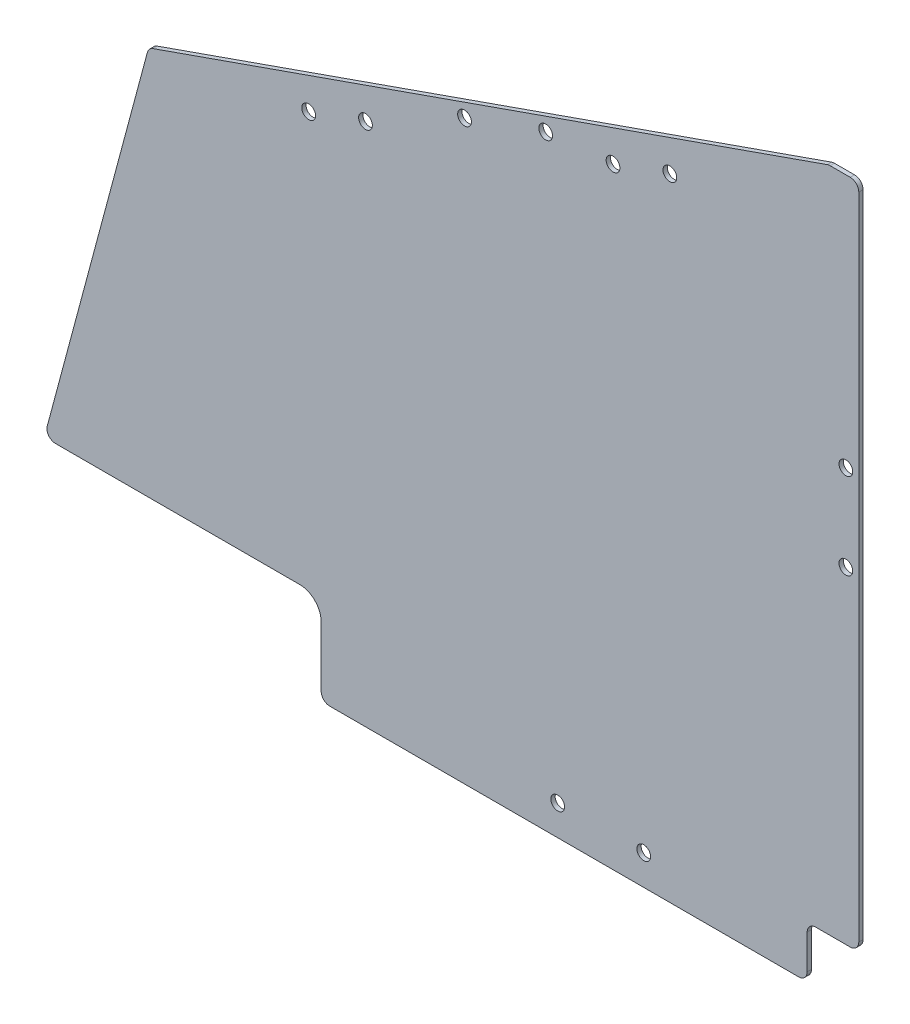
ISO-10303-21;
HEADER;
FILE_DESCRIPTION(('STEP AP214'),'2;1');
FILE_NAME('part.step','',(''),(''),'','','');
FILE_SCHEMA(('AUTOMOTIVE_DESIGN { 1 0 10303 214 1 1 1 1 }'));
ENDSEC;
DATA;
#1=APPLICATION_CONTEXT('core data for automotive mechanical design processes');
#2=APPLICATION_PROTOCOL_DEFINITION('international standard','automotive_design',2000,#1);
#3=PRODUCT_CONTEXT('',#1,'mechanical');
#4=PRODUCT('Part','Part','',(#3));
#5=PRODUCT_RELATED_PRODUCT_CATEGORY('part','',(#4));
#6=PRODUCT_DEFINITION_FORMATION('','',#4);
#7=PRODUCT_DEFINITION_CONTEXT('part definition',#1,'design');
#8=PRODUCT_DEFINITION('design','',#6,#7);
#9=PRODUCT_DEFINITION_SHAPE('','',#8);
#10=(LENGTH_UNIT() NAMED_UNIT(*) SI_UNIT(.MILLI.,.METRE.));
#11=(NAMED_UNIT(*) PLANE_ANGLE_UNIT() SI_UNIT($,.RADIAN.));
#12=(NAMED_UNIT(*) SI_UNIT($,.STERADIAN.) SOLID_ANGLE_UNIT());
#13=UNCERTAINTY_MEASURE_WITH_UNIT(LENGTH_MEASURE(1.E-05),#10,'distance_accuracy_value','');
#14=(GEOMETRIC_REPRESENTATION_CONTEXT(3) GLOBAL_UNCERTAINTY_ASSIGNED_CONTEXT((#13)) GLOBAL_UNIT_ASSIGNED_CONTEXT((#10,
#11,#12)) REPRESENTATION_CONTEXT('',''));
#15=CARTESIAN_POINT('',(0.,0.,0.));
#16=DIRECTION('',(0.,0.,1.));
#17=DIRECTION('',(1.,0.,0.));
#18=AXIS2_PLACEMENT_3D('',#15,#16,#17);
#19=CARTESIAN_POINT('',(95.,-83.5,1.));
#20=DIRECTION('',(-1.,0.,0.));
#21=DIRECTION('',(0.,0.,1.));
#22=AXIS2_PLACEMENT_3D('',#19,#20,#21);
#23=PLANE('',#22);
#24=DIRECTION('',(0.,1.,0.));
#25=VECTOR('',#24,1.);
#26=CARTESIAN_POINT('',(95.,-83.5,1.));
#27=LINE('',#26,#25);
#28=CARTESIAN_POINT('',(95.,-69.5,1.));
#29=VERTEX_POINT('',#28);
#30=CARTESIAN_POINT('',(95.,81.4999999999999,1.));
#31=VERTEX_POINT('',#30);
#32=EDGE_CURVE('E208',#29,#31,#27,.T.);
#33=ORIENTED_EDGE('',*,*,#32,.F.);
#34=DIRECTION('',(0.,0.,-1.));
#35=VECTOR('',#34,1.);
#36=CARTESIAN_POINT('',(95.,-69.5,1.));
#37=LINE('',#36,#35);
#38=CARTESIAN_POINT('',(95.,-69.5,0.));
#39=VERTEX_POINT('',#38);
#40=EDGE_CURVE('E296',#29,#39,#37,.T.);
#41=ORIENTED_EDGE('',*,*,#40,.T.);
#42=DIRECTION('',(0.,1.,0.));
#43=VECTOR('',#42,1.);
#44=CARTESIAN_POINT('',(95.,-83.5,0.));
#45=LINE('',#44,#43);
#46=CARTESIAN_POINT('',(95.,81.4999999999999,0.));
#47=VERTEX_POINT('',#46);
#48=EDGE_CURVE('E203',#39,#47,#45,.T.);
#49=ORIENTED_EDGE('',*,*,#48,.T.);
#50=DIRECTION('',(0.,0.,-1.));
#51=VECTOR('',#50,1.);
#52=CARTESIAN_POINT('',(95.,81.5,1.));
#53=LINE('',#52,#51);
#54=EDGE_CURVE('E239',#47,#31,#53,.F.);
#55=ORIENTED_EDGE('',*,*,#54,.T.);
#56=EDGE_LOOP('',(#33,#41,#49,#55));
#57=FACE_BOUND('',#56,.T.);
#58=ADVANCED_FACE('F36',(#57),#23,.F.);
#59=CARTESIAN_POINT('',(-95.,83.5,1.));
#60=DIRECTION('',(0.,-1.,0.));
#61=DIRECTION('',(0.,0.,-1.));
#62=AXIS2_PLACEMENT_3D('',#59,#60,#61);
#63=PLANE('',#62);
#64=DIRECTION('',(-1.,0.,0.));
#65=VECTOR('',#64,1.);
#66=CARTESIAN_POINT('',(-95.,83.5,1.));
#67=LINE('',#66,#65);
#68=CARTESIAN_POINT('',(93.,83.5,1.));
#69=VERTEX_POINT('',#68);
#70=CARTESIAN_POINT('',(88.3407996901378,83.5,1.));
#71=VERTEX_POINT('',#70);
#72=EDGE_CURVE('E210',#69,#71,#67,.T.);
#73=ORIENTED_EDGE('',*,*,#72,.F.);
#74=DIRECTION('',(0.,0.,-1.));
#75=VECTOR('',#74,1.);
#76=CARTESIAN_POINT('',(93.,83.5,1.));
#77=LINE('',#76,#75);
#78=CARTESIAN_POINT('',(93.,83.5,0.));
#79=VERTEX_POINT('',#78);
#80=EDGE_CURVE('E226',#69,#79,#77,.T.);
#81=ORIENTED_EDGE('',*,*,#80,.T.);
#82=DIRECTION('',(-1.,0.,0.));
#83=VECTOR('',#82,1.);
#84=CARTESIAN_POINT('',(-95.,83.5,0.));
#85=LINE('',#84,#83);
#86=CARTESIAN_POINT('',(88.3407996901378,83.5,0.));
#87=VERTEX_POINT('',#86);
#88=EDGE_CURVE('E217',#79,#87,#85,.T.);
#89=ORIENTED_EDGE('',*,*,#88,.T.);
#90=DIRECTION('',(0.,0.,-1.));
#91=VECTOR('',#90,1.);
#92=CARTESIAN_POINT('',(88.3407996901378,83.5,1.));
#93=LINE('',#92,#91);
#94=EDGE_CURVE('E224',#87,#71,#93,.F.);
#95=ORIENTED_EDGE('',*,*,#94,.T.);
#96=EDGE_LOOP('',(#73,#81,#89,#95));
#97=FACE_BOUND('',#96,.T.);
#98=ADVANCED_FACE('F392',(#97),#63,.F.);
#99=CARTESIAN_POINT('',(-95.,-83.5,1.));
#100=DIRECTION('',(0.,1.,0.));
#101=DIRECTION('',(0.,0.,1.));
#102=AXIS2_PLACEMENT_3D('',#99,#100,#101);
#103=PLANE('',#102);
#104=DIRECTION('',(1.,0.,0.));
#105=VECTOR('',#104,1.);
#106=CARTESIAN_POINT('',(-95.,-83.5,0.));
#107=LINE('',#106,#105);
#108=CARTESIAN_POINT('',(-28.,-83.5,0.));
#109=VERTEX_POINT('',#108);
#110=CARTESIAN_POINT('',(81.,-83.5,0.));
#111=VERTEX_POINT('',#110);
#112=EDGE_CURVE('E211',#109,#111,#107,.T.);
#113=ORIENTED_EDGE('',*,*,#112,.T.);
#114=DIRECTION('',(0.,0.,-1.));
#115=VECTOR('',#114,1.);
#116=CARTESIAN_POINT('',(81.,-83.5,1.));
#117=LINE('',#116,#115);
#118=CARTESIAN_POINT('',(81.,-83.5,1.));
#119=VERTEX_POINT('',#118);
#120=EDGE_CURVE('E287',#111,#119,#117,.F.);
#121=ORIENTED_EDGE('',*,*,#120,.T.);
#122=DIRECTION('',(1.,0.,0.));
#123=VECTOR('',#122,1.);
#124=CARTESIAN_POINT('',(-95.,-83.5,1.));
#125=LINE('',#124,#123);
#126=CARTESIAN_POINT('',(-28.,-83.5,1.));
#127=VERTEX_POINT('',#126);
#128=EDGE_CURVE('E185',#127,#119,#125,.T.);
#129=ORIENTED_EDGE('',*,*,#128,.F.);
#130=DIRECTION('',(0.,0.,-1.));
#131=VECTOR('',#130,1.);
#132=CARTESIAN_POINT('',(-28.,-83.5,1.));
#133=LINE('',#132,#131);
#134=EDGE_CURVE('E252',#127,#109,#133,.T.);
#135=ORIENTED_EDGE('',*,*,#134,.T.);
#136=EDGE_LOOP('',(#113,#121,#129,#135));
#137=FACE_BOUND('',#136,.T.);
#138=ADVANCED_FACE('F367',(#137),#103,.F.);
#139=CARTESIAN_POINT('',(0.,0.,1.));
#140=DIRECTION('',(0.,0.,-1.));
#141=DIRECTION('',(-1.,0.,0.));
#142=AXIS2_PLACEMENT_3D('',#139,#140,#141);
#143=PLANE('',#142);
#144=CARTESIAN_POINT('',(-32.9066829554804,33.7501487597334,1.));
#145=DIRECTION('',(0.,0.,1.));
#146=DIRECTION('',(1.,0.,0.));
#147=AXIS2_PLACEMENT_3D('',#144,#145,#146);
#148=CIRCLE('',#147,1.6);
#149=CARTESIAN_POINT('',(-31.3066829554804,33.7501487597334,1.));
#150=VERTEX_POINT('',#149);
#151=EDGE_CURVE('E304',#150,#150,#148,.T.);
#152=ORIENTED_EDGE('',*,*,#151,.F.);
#153=EDGE_LOOP('',(#152));
#154=FACE_BOUND('',#153,.T.);
#155=CARTESIAN_POINT('',(-19.6967533873127,38.386716542485,1.));
#156=DIRECTION('',(0.,0.,1.));
#157=DIRECTION('',(1.,0.,0.));
#158=AXIS2_PLACEMENT_3D('',#155,#156,#157);
#159=CIRCLE('',#158,1.6);
#160=CARTESIAN_POINT('',(-18.0967533873127,38.386716542485,1.));
#161=VERTEX_POINT('',#160);
#162=EDGE_CURVE('E626',#161,#161,#159,.T.);
#163=ORIENTED_EDGE('',*,*,#162,.F.);
#164=EDGE_LOOP('',(#163));
#165=FACE_BOUND('',#164,.T.);
#166=CARTESIAN_POINT('',(37.8607968739892,58.5889047387597,1.));
#167=DIRECTION('',(0.,0.,1.));
#168=DIRECTION('',(1.,0.,0.));
#169=AXIS2_PLACEMENT_3D('',#166,#167,#168);
#170=CIRCLE('',#169,1.6);
#171=CARTESIAN_POINT('',(39.4607968739892,58.5889047387597,1.));
#172=VERTEX_POINT('',#171);
#173=EDGE_CURVE('E629',#172,#172,#170,.T.);
#174=ORIENTED_EDGE('',*,*,#173,.F.);
#175=EDGE_LOOP('',(#174));
#176=FACE_BOUND('',#175,.T.);
#177=CARTESIAN_POINT('',(51.0707264421569,63.2254725215113,1.));
#178=DIRECTION('',(0.,0.,1.));
#179=DIRECTION('',(1.,0.,0.));
#180=AXIS2_PLACEMENT_3D('',#177,#178,#179);
#181=CIRCLE('',#180,1.6);
#182=CARTESIAN_POINT('',(52.6707264421569,63.2254725215113,1.));
#183=VERTEX_POINT('',#182);
#184=EDGE_CURVE('E322',#183,#183,#181,.T.);
#185=ORIENTED_EDGE('',*,*,#184,.F.);
#186=EDGE_LOOP('',(#185));
#187=FACE_BOUND('',#186,.T.);
#188=CARTESIAN_POINT('',(45.,-76.5,1.));
#189=DIRECTION('',(0.,0.,1.));
#190=DIRECTION('',(1.,0.,0.));
#191=AXIS2_PLACEMENT_3D('',#188,#189,#190);
#192=CIRCLE('',#191,1.6);
#193=CARTESIAN_POINT('',(46.6,-76.5,1.));
#194=VERTEX_POINT('',#193);
#195=EDGE_CURVE('E275',#194,#194,#192,.T.);
#196=ORIENTED_EDGE('',*,*,#195,.F.);
#197=EDGE_LOOP('',(#196));
#198=FACE_BOUND('',#197,.T.);
#199=CARTESIAN_POINT('',(25.,-76.5,1.));
#200=DIRECTION('',(0.,0.,1.));
#201=DIRECTION('',(1.,0.,0.));
#202=AXIS2_PLACEMENT_3D('',#199,#200,#201);
#203=CIRCLE('',#202,1.6);
#204=CARTESIAN_POINT('',(26.6,-76.5,1.));
#205=VERTEX_POINT('',#204);
#206=EDGE_CURVE('E329',#205,#205,#203,.T.);
#207=ORIENTED_EDGE('',*,*,#206,.F.);
#208=EDGE_LOOP('',(#207));
#209=FACE_BOUND('',#208,.T.);
#210=CARTESIAN_POINT('',(22.2057566978976,57.2273793176486,0.999999999999999));
#211=DIRECTION('',(0.,0.,-1.));
#212=DIRECTION('',(-1.,0.,0.));
#213=AXIS2_PLACEMENT_3D('',#210,#211,#212);
#214=CIRCLE('',#213,1.6);
#215=CARTESIAN_POINT('',(20.6057566978976,57.2273793176486,0.999999999999999));
#216=VERTEX_POINT('',#215);
#217=EDGE_CURVE('E342',#216,#216,#214,.T.);
#218=ORIENTED_EDGE('',*,*,#217,.T.);
#219=EDGE_LOOP('',(#218));
#220=FACE_BOUND('',#219,.T.);
#221=CARTESIAN_POINT('',(3.33442874337234,50.6037110565749,0.999999999999999));
#222=DIRECTION('',(0.,0.,-1.));
#223=DIRECTION('',(-1.,0.,0.));
#224=AXIS2_PLACEMENT_3D('',#221,#222,#223);
#225=CIRCLE('',#224,1.6);
#226=CARTESIAN_POINT('',(1.73442874337234,50.6037110565749,0.999999999999999));
#227=VERTEX_POINT('',#226);
#228=EDGE_CURVE('E337',#227,#227,#225,.T.);
#229=ORIENTED_EDGE('',*,*,#228,.T.);
#230=EDGE_LOOP('',(#229));
#231=FACE_BOUND('',#230,.T.);
#232=CARTESIAN_POINT('',(92.,4.50000000000004,1.));
#233=DIRECTION('',(0.,0.,-1.));
#234=DIRECTION('',(-1.,0.,0.));
#235=AXIS2_PLACEMENT_3D('',#232,#233,#234);
#236=CIRCLE('',#235,1.60000000000001);
#237=CARTESIAN_POINT('',(90.4,4.50000000000004,1.));
#238=VERTEX_POINT('',#237);
#239=EDGE_CURVE('E196',#238,#238,#236,.T.);
#240=ORIENTED_EDGE('',*,*,#239,.T.);
#241=EDGE_LOOP('',(#240));
#242=FACE_BOUND('',#241,.T.);
#243=CARTESIAN_POINT('',(92.,24.5,1.));
#244=DIRECTION('',(0.,0.,-1.));
#245=DIRECTION('',(-1.,0.,0.));
#246=AXIS2_PLACEMENT_3D('',#243,#244,#245);
#247=CIRCLE('',#246,1.6);
#248=CARTESIAN_POINT('',(90.4,24.5,1.));
#249=VERTEX_POINT('',#248);
#250=EDGE_CURVE('E351',#249,#249,#247,.T.);
#251=ORIENTED_EDGE('',*,*,#250,.T.);
#252=EDGE_LOOP('',(#251));
#253=FACE_BOUND('',#252,.T.);
#254=ORIENTED_EDGE('',*,*,#128,.T.);
#255=CARTESIAN_POINT('',(81.,-81.5,0.999999999999999));
#256=DIRECTION('',(0.,0.,-1.));
#257=DIRECTION('',(-1.,0.,0.));
#258=AXIS2_PLACEMENT_3D('',#255,#256,#257);
#259=CIRCLE('',#258,2.);
#260=CARTESIAN_POINT('',(83.,-81.5,1.));
#261=VERTEX_POINT('',#260);
#262=EDGE_CURVE('E290',#119,#261,#259,.F.);
#263=ORIENTED_EDGE('',*,*,#262,.T.);
#264=DIRECTION('',(0.,1.,0.));
#265=VECTOR('',#264,1.);
#266=CARTESIAN_POINT('',(83.,0.,1.));
#267=LINE('',#266,#265);
#268=CARTESIAN_POINT('',(83.,-73.5,1.));
#269=VERTEX_POINT('',#268);
#270=EDGE_CURVE('E319',#261,#269,#267,.T.);
#271=ORIENTED_EDGE('',*,*,#270,.T.);
#272=CARTESIAN_POINT('',(85.,-73.5,0.999999999999999));
#273=DIRECTION('',(0.,0.,-1.));
#274=DIRECTION('',(-1.,0.,0.));
#275=AXIS2_PLACEMENT_3D('',#272,#273,#274);
#276=CIRCLE('',#275,2.);
#277=CARTESIAN_POINT('',(85.,-71.5,1.));
#278=VERTEX_POINT('',#277);
#279=EDGE_CURVE('E11',#269,#278,#276,.T.);
#280=ORIENTED_EDGE('',*,*,#279,.T.);
#281=DIRECTION('',(1.,0.,0.));
#282=VECTOR('',#281,1.);
#283=CARTESIAN_POINT('',(0.,-71.5,1.));
#284=LINE('',#283,#282);
#285=CARTESIAN_POINT('',(93.,-71.5,1.));
#286=VERTEX_POINT('',#285);
#287=EDGE_CURVE('E327',#278,#286,#284,.T.);
#288=ORIENTED_EDGE('',*,*,#287,.T.);
#289=CARTESIAN_POINT('',(93.,-69.5,1.));
#290=DIRECTION('',(0.,0.,-1.));
#291=DIRECTION('',(-1.,0.,0.));
#292=AXIS2_PLACEMENT_3D('',#289,#290,#291);
#293=CIRCLE('',#292,2.);
#294=EDGE_CURVE('E53',#286,#29,#293,.F.);
#295=ORIENTED_EDGE('',*,*,#294,.T.);
#296=ORIENTED_EDGE('',*,*,#32,.T.);
#297=CARTESIAN_POINT('',(93.,81.5,1.));
#298=DIRECTION('',(0.,0.,-1.));
#299=DIRECTION('',(-1.,0.,0.));
#300=AXIS2_PLACEMENT_3D('',#297,#298,#299);
#301=CIRCLE('',#300,2.);
#302=EDGE_CURVE('E250',#31,#69,#301,.F.);
#303=ORIENTED_EDGE('',*,*,#302,.T.);
#304=ORIENTED_EDGE('',*,*,#72,.T.);
#305=CARTESIAN_POINT('',(88.3407996901378,81.5,1.));
#306=DIRECTION('',(0.,0.,-1.));
#307=DIRECTION('',(-1.,0.,0.));
#308=AXIS2_PLACEMENT_3D('',#305,#306,#307);
#309=CIRCLE('',#308,2.);
#310=CARTESIAN_POINT('',(87.6784328640304,83.3871327954525,1.));
#311=VERTEX_POINT('',#310);
#312=EDGE_CURVE('E246',#71,#311,#309,.F.);
#313=ORIENTED_EDGE('',*,*,#312,.T.);
#314=DIRECTION('',(-0.943566397726261,-0.331183413053685,0.));
#315=VECTOR('',#314,1.);
#316=CARTESIAN_POINT('',(88.,83.5,1.));
#317=LINE('',#316,#315);
#318=CARTESIAN_POINT('',(-69.1274427162054,28.3496651761363,1.));
#319=VERTEX_POINT('',#318);
#320=EDGE_CURVE('E207',#311,#319,#317,.T.);
#321=ORIENTED_EDGE('',*,*,#320,.T.);
#322=CARTESIAN_POINT('',(-68.465075890098,26.4625323806838,1.));
#323=DIRECTION('',(0.,0.,-1.));
#324=DIRECTION('',(-1.,0.,0.));
#325=AXIS2_PLACEMENT_3D('',#322,#323,#324);
#326=CIRCLE('',#325,2.);
#327=CARTESIAN_POINT('',(-70.3969275426762,26.9801704708888,1.));
#328=VERTEX_POINT('',#327);
#329=EDGE_CURVE('E248',#319,#328,#326,.F.);
#330=ORIENTED_EDGE('',*,*,#329,.T.);
#331=DIRECTION('',(-0.258819045102491,-0.965925826289076,0.));
#332=VECTOR('',#331,1.);
#333=CARTESIAN_POINT('',(-100.,-83.5,1.));
#334=LINE('',#333,#332);
#335=CARTESIAN_POINT('',(-93.6984678658429,-59.982361909795,1.));
#336=VERTEX_POINT('',#335);
#337=EDGE_CURVE('E200',#328,#336,#334,.T.);
#338=ORIENTED_EDGE('',*,*,#337,.T.);
#339=CARTESIAN_POINT('',(-91.7666162132648,-60.5,1.));
#340=DIRECTION('',(0.,0.,-1.));
#341=DIRECTION('',(-1.,0.,0.));
#342=AXIS2_PLACEMENT_3D('',#339,#340,#341);
#343=CIRCLE('',#342,2.);
#344=CARTESIAN_POINT('',(-91.7666162132648,-62.5,1.));
#345=VERTEX_POINT('',#344);
#346=EDGE_CURVE('E242',#336,#345,#343,.F.);
#347=ORIENTED_EDGE('',*,*,#346,.T.);
#348=DIRECTION('',(1.,0.,0.));
#349=VECTOR('',#348,1.);
#350=CARTESIAN_POINT('',(-30.,-62.5,1.));
#351=LINE('',#350,#349);
#352=CARTESIAN_POINT('',(-35.,-62.5,1.));
#353=VERTEX_POINT('',#352);
#354=EDGE_CURVE('E192',#345,#353,#351,.T.);
#355=ORIENTED_EDGE('',*,*,#354,.T.);
#356=CARTESIAN_POINT('',(-35.,-67.5,1.));
#357=DIRECTION('',(0.,0.,-1.));
#358=DIRECTION('',(-1.,0.,0.));
#359=AXIS2_PLACEMENT_3D('',#356,#357,#358);
#360=CIRCLE('',#359,5.);
#361=CARTESIAN_POINT('',(-30.,-67.5,1.));
#362=VERTEX_POINT('',#361);
#363=EDGE_CURVE('E175',#353,#362,#360,.T.);
#364=ORIENTED_EDGE('',*,*,#363,.T.);
#365=DIRECTION('',(0.,-1.,0.));
#366=VECTOR('',#365,1.);
#367=CARTESIAN_POINT('',(-30.,-83.5,1.));
#368=LINE('',#367,#366);
#369=CARTESIAN_POINT('',(-30.,-81.5,1.));
#370=VERTEX_POINT('',#369);
#371=EDGE_CURVE('E184',#362,#370,#368,.T.);
#372=ORIENTED_EDGE('',*,*,#371,.T.);
#373=CARTESIAN_POINT('',(-28.,-81.5,1.));
#374=DIRECTION('',(0.,0.,-1.));
#375=DIRECTION('',(-1.,0.,0.));
#376=AXIS2_PLACEMENT_3D('',#373,#374,#375);
#377=CIRCLE('',#376,2.);
#378=EDGE_CURVE('E244',#370,#127,#377,.F.);
#379=ORIENTED_EDGE('',*,*,#378,.T.);
#380=EDGE_LOOP('',(#254,#263,#271,#280,#288,#295,#296,#303,#304,#313,#321,#330,#338,#347,#355,
#364,#372,#379));
#381=FACE_BOUND('',#380,.T.);
#382=ADVANCED_FACE('F361',(#154,#165,#176,#187,#198,#209,#220,#231,#242,#253,#381),#143,.F.);
#383=CARTESIAN_POINT('',(0.,0.,0.));
#384=DIRECTION('',(0.,0.,-1.));
#385=DIRECTION('',(-1.,0.,0.));
#386=AXIS2_PLACEMENT_3D('',#383,#384,#385);
#387=PLANE('',#386);
#388=CARTESIAN_POINT('',(-32.9066829554804,33.7501487597334,0.));
#389=DIRECTION('',(0.,0.,-1.));
#390=DIRECTION('',(-1.,0.,0.));
#391=AXIS2_PLACEMENT_3D('',#388,#389,#390);
#392=CIRCLE('',#391,1.6);
#393=CARTESIAN_POINT('',(-34.5066829554804,33.7501487597334,0.));
#394=VERTEX_POINT('',#393);
#395=EDGE_CURVE('E40',#394,#394,#392,.T.);
#396=ORIENTED_EDGE('',*,*,#395,.F.);
#397=EDGE_LOOP('',(#396));
#398=FACE_BOUND('',#397,.T.);
#399=CARTESIAN_POINT('',(-19.6967533873127,38.386716542485,0.));
#400=DIRECTION('',(0.,0.,-1.));
#401=DIRECTION('',(-1.,0.,0.));
#402=AXIS2_PLACEMENT_3D('',#399,#400,#401);
#403=CIRCLE('',#402,1.6);
#404=CARTESIAN_POINT('',(-21.2967533873127,38.386716542485,0.));
#405=VERTEX_POINT('',#404);
#406=EDGE_CURVE('E306',#405,#405,#403,.T.);
#407=ORIENTED_EDGE('',*,*,#406,.F.);
#408=EDGE_LOOP('',(#407));
#409=FACE_BOUND('',#408,.T.);
#410=CARTESIAN_POINT('',(37.8607968739892,58.5889047387597,0.));
#411=DIRECTION('',(0.,0.,-1.));
#412=DIRECTION('',(-1.,0.,0.));
#413=AXIS2_PLACEMENT_3D('',#410,#411,#412);
#414=CIRCLE('',#413,1.6);
#415=CARTESIAN_POINT('',(36.2607968739892,58.5889047387597,0.));
#416=VERTEX_POINT('',#415);
#417=EDGE_CURVE('E303',#416,#416,#414,.T.);
#418=ORIENTED_EDGE('',*,*,#417,.F.);
#419=EDGE_LOOP('',(#418));
#420=FACE_BOUND('',#419,.T.);
#421=CARTESIAN_POINT('',(51.0707264421569,63.2254725215113,0.));
#422=DIRECTION('',(0.,0.,-1.));
#423=DIRECTION('',(-1.,0.,0.));
#424=AXIS2_PLACEMENT_3D('',#421,#422,#423);
#425=CIRCLE('',#424,1.6);
#426=CARTESIAN_POINT('',(49.4707264421569,63.2254725215113,0.));
#427=VERTEX_POINT('',#426);
#428=EDGE_CURVE('E300',#427,#427,#425,.T.);
#429=ORIENTED_EDGE('',*,*,#428,.F.);
#430=EDGE_LOOP('',(#429));
#431=FACE_BOUND('',#430,.T.);
#432=DIRECTION('',(0.,1.,0.));
#433=VECTOR('',#432,1.);
#434=CARTESIAN_POINT('',(83.,-71.5,0.));
#435=LINE('',#434,#433);
#436=CARTESIAN_POINT('',(83.,-81.5,0.));
#437=VERTEX_POINT('',#436);
#438=CARTESIAN_POINT('',(83.,-73.5,0.));
#439=VERTEX_POINT('',#438);
#440=EDGE_CURVE('E311',#437,#439,#435,.T.);
#441=ORIENTED_EDGE('',*,*,#440,.F.);
#442=CARTESIAN_POINT('',(81.,-81.5,0.));
#443=DIRECTION('',(0.,0.,-1.));
#444=DIRECTION('',(-1.,0.,0.));
#445=AXIS2_PLACEMENT_3D('',#442,#443,#444);
#446=CIRCLE('',#445,2.);
#447=EDGE_CURVE('E285',#437,#111,#446,.T.);
#448=ORIENTED_EDGE('',*,*,#447,.T.);
#449=ORIENTED_EDGE('',*,*,#112,.F.);
#450=CARTESIAN_POINT('',(-28.,-81.5,0.));
#451=DIRECTION('',(0.,0.,-1.));
#452=DIRECTION('',(-1.,0.,0.));
#453=AXIS2_PLACEMENT_3D('',#450,#451,#452);
#454=CIRCLE('',#453,2.);
#455=CARTESIAN_POINT('',(-30.,-81.5,0.));
#456=VERTEX_POINT('',#455);
#457=EDGE_CURVE('E191',#109,#456,#454,.T.);
#458=ORIENTED_EDGE('',*,*,#457,.T.);
#459=DIRECTION('',(0.,-1.,0.));
#460=VECTOR('',#459,1.);
#461=CARTESIAN_POINT('',(-30.,-83.5,0.));
#462=LINE('',#461,#460);
#463=CARTESIAN_POINT('',(-30.,-67.5,0.));
#464=VERTEX_POINT('',#463);
#465=EDGE_CURVE('E181',#464,#456,#462,.T.);
#466=ORIENTED_EDGE('',*,*,#465,.F.);
#467=CARTESIAN_POINT('',(-35.,-67.5,0.));
#468=DIRECTION('',(0.,0.,-1.));
#469=DIRECTION('',(-1.,0.,0.));
#470=AXIS2_PLACEMENT_3D('',#467,#468,#469);
#471=CIRCLE('',#470,5.);
#472=CARTESIAN_POINT('',(-35.,-62.5,0.));
#473=VERTEX_POINT('',#472);
#474=EDGE_CURVE('E165',#464,#473,#471,.F.);
#475=ORIENTED_EDGE('',*,*,#474,.T.);
#476=DIRECTION('',(1.,0.,0.));
#477=VECTOR('',#476,1.);
#478=CARTESIAN_POINT('',(-30.,-62.5,0.));
#479=LINE('',#478,#477);
#480=CARTESIAN_POINT('',(-91.7666162132648,-62.5,0.));
#481=VERTEX_POINT('',#480);
#482=EDGE_CURVE('E193',#481,#473,#479,.T.);
#483=ORIENTED_EDGE('',*,*,#482,.F.);
#484=CARTESIAN_POINT('',(-91.7666162132648,-60.5,0.));
#485=DIRECTION('',(0.,0.,-1.));
#486=DIRECTION('',(-1.,0.,0.));
#487=AXIS2_PLACEMENT_3D('',#484,#485,#486);
#488=CIRCLE('',#487,2.);
#489=CARTESIAN_POINT('',(-93.6984678658429,-59.982361909795,0.));
#490=VERTEX_POINT('',#489);
#491=EDGE_CURVE('E229',#481,#490,#488,.T.);
#492=ORIENTED_EDGE('',*,*,#491,.T.);
#493=DIRECTION('',(-0.258819045102491,-0.965925826289076,0.));
#494=VECTOR('',#493,1.);
#495=CARTESIAN_POINT('',(-100.,-83.5,0.));
#496=LINE('',#495,#494);
#497=CARTESIAN_POINT('',(-70.3969275426762,26.9801704708888,0.));
#498=VERTEX_POINT('',#497);
#499=EDGE_CURVE('E204',#498,#490,#496,.T.);
#500=ORIENTED_EDGE('',*,*,#499,.F.);
#501=CARTESIAN_POINT('',(-68.465075890098,26.4625323806838,0.));
#502=DIRECTION('',(0.,0.,-1.));
#503=DIRECTION('',(-1.,0.,0.));
#504=AXIS2_PLACEMENT_3D('',#501,#502,#503);
#505=CIRCLE('',#504,2.);
#506=CARTESIAN_POINT('',(-69.1274427162054,28.3496651761363,0.));
#507=VERTEX_POINT('',#506);
#508=EDGE_CURVE('E234',#498,#507,#505,.T.);
#509=ORIENTED_EDGE('',*,*,#508,.T.);
#510=DIRECTION('',(-0.943566397726261,-0.331183413053685,0.));
#511=VECTOR('',#510,1.);
#512=CARTESIAN_POINT('',(88.,83.5,0.));
#513=LINE('',#512,#511);
#514=CARTESIAN_POINT('',(87.6784328640304,83.3871327954525,0.));
#515=VERTEX_POINT('',#514);
#516=EDGE_CURVE('E358',#515,#507,#513,.T.);
#517=ORIENTED_EDGE('',*,*,#516,.F.);
#518=CARTESIAN_POINT('',(88.3407996901378,81.5,0.));
#519=DIRECTION('',(0.,0.,-1.));
#520=DIRECTION('',(-1.,0.,0.));
#521=AXIS2_PLACEMENT_3D('',#518,#519,#520);
#522=CIRCLE('',#521,2.);
#523=EDGE_CURVE('E232',#515,#87,#522,.T.);
#524=ORIENTED_EDGE('',*,*,#523,.T.);
#525=ORIENTED_EDGE('',*,*,#88,.F.);
#526=CARTESIAN_POINT('',(93.,81.5,0.));
#527=DIRECTION('',(0.,0.,-1.));
#528=DIRECTION('',(-1.,0.,0.));
#529=AXIS2_PLACEMENT_3D('',#526,#527,#528);
#530=CIRCLE('',#529,2.);
#531=EDGE_CURVE('E236',#79,#47,#530,.T.);
#532=ORIENTED_EDGE('',*,*,#531,.T.);
#533=ORIENTED_EDGE('',*,*,#48,.F.);
#534=CARTESIAN_POINT('',(93.,-69.5,0.));
#535=DIRECTION('',(0.,0.,-1.));
#536=DIRECTION('',(-1.,0.,0.));
#537=AXIS2_PLACEMENT_3D('',#534,#535,#536);
#538=CIRCLE('',#537,2.);
#539=CARTESIAN_POINT('',(93.,-71.5,0.));
#540=VERTEX_POINT('',#539);
#541=EDGE_CURVE('E283',#39,#540,#538,.T.);
#542=ORIENTED_EDGE('',*,*,#541,.T.);
#543=DIRECTION('',(1.,0.,0.));
#544=VECTOR('',#543,1.);
#545=CARTESIAN_POINT('',(95.,-71.5,0.));
#546=LINE('',#545,#544);
#547=CARTESIAN_POINT('',(85.,-71.5,0.));
#548=VERTEX_POINT('',#547);
#549=EDGE_CURVE('E315',#548,#540,#546,.T.);
#550=ORIENTED_EDGE('',*,*,#549,.F.);
#551=CARTESIAN_POINT('',(85.,-73.5,0.));
#552=DIRECTION('',(0.,0.,-1.));
#553=DIRECTION('',(-1.,0.,0.));
#554=AXIS2_PLACEMENT_3D('',#551,#552,#553);
#555=CIRCLE('',#554,2.);
#556=EDGE_CURVE('E45',#548,#439,#555,.F.);
#557=ORIENTED_EDGE('',*,*,#556,.T.);
#558=EDGE_LOOP('',(#441,#448,#449,#458,#466,#475,#483,#492,#500,#509,#517,#524,#525,#532,#533,
#542,#550,#557));
#559=FACE_BOUND('',#558,.T.);
#560=CARTESIAN_POINT('',(45.,-76.5,0.));
#561=DIRECTION('',(0.,0.,-1.));
#562=DIRECTION('',(-1.,0.,0.));
#563=AXIS2_PLACEMENT_3D('',#560,#561,#562);
#564=CIRCLE('',#563,1.6);
#565=CARTESIAN_POINT('',(43.4,-76.5,0.));
#566=VERTEX_POINT('',#565);
#567=EDGE_CURVE('E274',#566,#566,#564,.T.);
#568=ORIENTED_EDGE('',*,*,#567,.F.);
#569=EDGE_LOOP('',(#568));
#570=FACE_BOUND('',#569,.T.);
#571=CARTESIAN_POINT('',(25.,-76.5,0.));
#572=DIRECTION('',(0.,0.,-1.));
#573=DIRECTION('',(-1.,0.,0.));
#574=AXIS2_PLACEMENT_3D('',#571,#572,#573);
#575=CIRCLE('',#574,1.6);
#576=CARTESIAN_POINT('',(23.4,-76.5,0.));
#577=VERTEX_POINT('',#576);
#578=EDGE_CURVE('E271',#577,#577,#575,.T.);
#579=ORIENTED_EDGE('',*,*,#578,.F.);
#580=EDGE_LOOP('',(#579));
#581=FACE_BOUND('',#580,.T.);
#582=CARTESIAN_POINT('',(22.2057566978976,57.2273793176486,0.));
#583=DIRECTION('',(0.,0.,-1.));
#584=DIRECTION('',(-1.,0.,0.));
#585=AXIS2_PLACEMENT_3D('',#582,#583,#584);
#586=CIRCLE('',#585,1.6);
#587=CARTESIAN_POINT('',(20.6057566978976,57.2273793176486,0.));
#588=VERTEX_POINT('',#587);
#589=EDGE_CURVE('E334',#588,#588,#586,.T.);
#590=ORIENTED_EDGE('',*,*,#589,.F.);
#591=EDGE_LOOP('',(#590));
#592=FACE_BOUND('',#591,.T.);
#593=CARTESIAN_POINT('',(3.33442874337234,50.6037110565749,0.));
#594=DIRECTION('',(0.,0.,-1.));
#595=DIRECTION('',(-1.,0.,0.));
#596=AXIS2_PLACEMENT_3D('',#593,#594,#595);
#597=CIRCLE('',#596,1.6);
#598=CARTESIAN_POINT('',(1.73442874337234,50.6037110565749,0.));
#599=VERTEX_POINT('',#598);
#600=EDGE_CURVE('E278',#599,#599,#597,.T.);
#601=ORIENTED_EDGE('',*,*,#600,.F.);
#602=EDGE_LOOP('',(#601));
#603=FACE_BOUND('',#602,.T.);
#604=CARTESIAN_POINT('',(92.,4.50000000000004,0.));
#605=DIRECTION('',(0.,0.,-1.));
#606=DIRECTION('',(-1.,0.,0.));
#607=AXIS2_PLACEMENT_3D('',#604,#605,#606);
#608=CIRCLE('',#607,1.60000000000001);
#609=CARTESIAN_POINT('',(90.4,4.50000000000004,0.));
#610=VERTEX_POINT('',#609);
#611=EDGE_CURVE('E348',#610,#610,#608,.T.);
#612=ORIENTED_EDGE('',*,*,#611,.F.);
#613=EDGE_LOOP('',(#612));
#614=FACE_BOUND('',#613,.T.);
#615=CARTESIAN_POINT('',(92.,24.5,0.));
#616=DIRECTION('',(0.,0.,-1.));
#617=DIRECTION('',(-1.,0.,0.));
#618=AXIS2_PLACEMENT_3D('',#615,#616,#617);
#619=CIRCLE('',#618,1.6);
#620=CARTESIAN_POINT('',(90.4,24.5,0.));
#621=VERTEX_POINT('',#620);
#622=EDGE_CURVE('E345',#621,#621,#619,.T.);
#623=ORIENTED_EDGE('',*,*,#622,.F.);
#624=EDGE_LOOP('',(#623));
#625=FACE_BOUND('',#624,.T.);
#626=ADVANCED_FACE('F188',(#398,#409,#420,#431,#559,#570,#581,#592,#603,#614,#625),#387,.T.);
#627=CARTESIAN_POINT('',(-100.,-83.5,1.));
#628=DIRECTION('',(0.965925826289076,-0.258819045102491,0.));
#629=DIRECTION('',(0.258819045102491,0.965925826289076,0.));
#630=AXIS2_PLACEMENT_3D('',#627,#628,#629);
#631=PLANE('',#630);
#632=ORIENTED_EDGE('',*,*,#337,.F.);
#633=DIRECTION('',(0.,0.,-1.));
#634=VECTOR('',#633,1.);
#635=CARTESIAN_POINT('',(-70.3969275426762,26.9801704708888,1.));
#636=LINE('',#635,#634);
#637=EDGE_CURVE('E258',#328,#498,#636,.T.);
#638=ORIENTED_EDGE('',*,*,#637,.T.);
#639=ORIENTED_EDGE('',*,*,#499,.T.);
#640=DIRECTION('',(0.,0.,1.));
#641=VECTOR('',#640,1.);
#642=CARTESIAN_POINT('',(-93.6984678658429,-59.982361909795,1.));
#643=LINE('',#642,#641);
#644=EDGE_CURVE('E255',#490,#336,#643,.T.);
#645=ORIENTED_EDGE('',*,*,#644,.T.);
#646=EDGE_LOOP('',(#632,#638,#639,#645));
#647=FACE_BOUND('',#646,.T.);
#648=ADVANCED_FACE('F410',(#647),#631,.F.);
#649=CARTESIAN_POINT('',(-30.,-62.5,1.));
#650=DIRECTION('',(0.,1.,0.));
#651=DIRECTION('',(0.,0.,1.));
#652=AXIS2_PLACEMENT_3D('',#649,#650,#651);
#653=PLANE('',#652);
#654=ORIENTED_EDGE('',*,*,#354,.F.);
#655=DIRECTION('',(0.,0.,1.));
#656=VECTOR('',#655,1.);
#657=CARTESIAN_POINT('',(-91.7666162132648,-62.5,1.));
#658=LINE('',#657,#656);
#659=EDGE_CURVE('E268',#345,#481,#658,.F.);
#660=ORIENTED_EDGE('',*,*,#659,.T.);
#661=ORIENTED_EDGE('',*,*,#482,.T.);
#662=DIRECTION('',(0.,0.,-1.));
#663=VECTOR('',#662,1.);
#664=CARTESIAN_POINT('',(-35.,-62.5,1.));
#665=LINE('',#664,#663);
#666=EDGE_CURVE('E171',#473,#353,#665,.F.);
#667=ORIENTED_EDGE('',*,*,#666,.T.);
#668=EDGE_LOOP('',(#654,#660,#661,#667));
#669=FACE_BOUND('',#668,.T.);
#670=ADVANCED_FACE('F419',(#669),#653,.F.);
#671=CARTESIAN_POINT('',(-30.,-83.5,1.));
#672=DIRECTION('',(1.,0.,0.));
#673=DIRECTION('',(0.,0.,-1.));
#674=AXIS2_PLACEMENT_3D('',#671,#672,#673);
#675=PLANE('',#674);
#676=ORIENTED_EDGE('',*,*,#465,.T.);
#677=DIRECTION('',(0.,0.,-1.));
#678=VECTOR('',#677,1.);
#679=CARTESIAN_POINT('',(-30.,-81.5,1.));
#680=LINE('',#679,#678);
#681=EDGE_CURVE('E266',#456,#370,#680,.F.);
#682=ORIENTED_EDGE('',*,*,#681,.T.);
#683=ORIENTED_EDGE('',*,*,#371,.F.);
#684=DIRECTION('',(0.,0.,-1.));
#685=VECTOR('',#684,1.);
#686=CARTESIAN_POINT('',(-30.,-67.5,0.));
#687=LINE('',#686,#685);
#688=EDGE_CURVE('E169',#362,#464,#687,.T.);
#689=ORIENTED_EDGE('',*,*,#688,.T.);
#690=EDGE_LOOP('',(#676,#682,#683,#689));
#691=FACE_BOUND('',#690,.T.);
#692=ADVANCED_FACE('F180',(#691),#675,.F.);
#693=CARTESIAN_POINT('',(88.,83.5,1.));
#694=DIRECTION('',(0.331183413053685,-0.943566397726261,0.));
#695=DIRECTION('',(0.943566397726261,0.331183413053685,0.));
#696=AXIS2_PLACEMENT_3D('',#693,#694,#695);
#697=PLANE('',#696);
#698=ORIENTED_EDGE('',*,*,#516,.T.);
#699=DIRECTION('',(0.,0.,-1.));
#700=VECTOR('',#699,1.);
#701=CARTESIAN_POINT('',(-69.1274427162054,28.3496651761363,1.));
#702=LINE('',#701,#700);
#703=EDGE_CURVE('E264',#507,#319,#702,.F.);
#704=ORIENTED_EDGE('',*,*,#703,.T.);
#705=ORIENTED_EDGE('',*,*,#320,.F.);
#706=DIRECTION('',(0.,0.,-1.));
#707=VECTOR('',#706,1.);
#708=CARTESIAN_POINT('',(87.6784328640304,83.3871327954525,1.));
#709=LINE('',#708,#707);
#710=EDGE_CURVE('E261',#311,#515,#709,.T.);
#711=ORIENTED_EDGE('',*,*,#710,.T.);
#712=EDGE_LOOP('',(#698,#704,#705,#711));
#713=FACE_BOUND('',#712,.T.);
#714=ADVANCED_FACE('F403',(#713),#697,.F.);
#715=CARTESIAN_POINT('',(92.,24.5,1.));
#716=DIRECTION('',(0.,0.,-1.));
#717=DIRECTION('',(-1.,0.,0.));
#718=AXIS2_PLACEMENT_3D('',#715,#716,#717);
#719=CYLINDRICAL_SURFACE('',#718,1.6);
#720=ORIENTED_EDGE('',*,*,#250,.F.);
#721=EDGE_LOOP('',(#720));
#722=FACE_BOUND('',#721,.T.);
#723=ORIENTED_EDGE('',*,*,#622,.T.);
#724=EDGE_LOOP('',(#723));
#725=FACE_BOUND('',#724,.T.);
#726=ADVANCED_FACE('F492',(#722,#725),#719,.F.);
#727=CARTESIAN_POINT('',(92.,4.50000000000004,1.));
#728=DIRECTION('',(0.,0.,-1.));
#729=DIRECTION('',(-1.,0.,0.));
#730=AXIS2_PLACEMENT_3D('',#727,#728,#729);
#731=CYLINDRICAL_SURFACE('',#730,1.60000000000001);
#732=ORIENTED_EDGE('',*,*,#239,.F.);
#733=EDGE_LOOP('',(#732));
#734=FACE_BOUND('',#733,.T.);
#735=ORIENTED_EDGE('',*,*,#611,.T.);
#736=EDGE_LOOP('',(#735));
#737=FACE_BOUND('',#736,.T.);
#738=ADVANCED_FACE('F488',(#734,#737),#731,.F.);
#739=CARTESIAN_POINT('',(3.33442874337234,50.6037110565749,10.));
#740=DIRECTION('',(0.,0.,-1.));
#741=DIRECTION('',(-1.,0.,0.));
#742=AXIS2_PLACEMENT_3D('',#739,#740,#741);
#743=CYLINDRICAL_SURFACE('',#742,1.6);
#744=ORIENTED_EDGE('',*,*,#600,.T.);
#745=EDGE_LOOP('',(#744));
#746=FACE_BOUND('',#745,.T.);
#747=ORIENTED_EDGE('',*,*,#228,.F.);
#748=EDGE_LOOP('',(#747));
#749=FACE_BOUND('',#748,.T.);
#750=ADVANCED_FACE('F484',(#746,#749),#743,.F.);
#751=CARTESIAN_POINT('',(22.2057566978976,57.2273793176486,10.));
#752=DIRECTION('',(0.,0.,-1.));
#753=DIRECTION('',(-1.,0.,0.));
#754=AXIS2_PLACEMENT_3D('',#751,#752,#753);
#755=CYLINDRICAL_SURFACE('',#754,1.6);
#756=ORIENTED_EDGE('',*,*,#589,.T.);
#757=EDGE_LOOP('',(#756));
#758=FACE_BOUND('',#757,.T.);
#759=ORIENTED_EDGE('',*,*,#217,.F.);
#760=EDGE_LOOP('',(#759));
#761=FACE_BOUND('',#760,.T.);
#762=ADVANCED_FACE('F438',(#758,#761),#755,.F.);
#763=CARTESIAN_POINT('',(-35.,-67.5,1.));
#764=DIRECTION('',(0.,0.,1.));
#765=DIRECTION('',(1.,0.,0.));
#766=AXIS2_PLACEMENT_3D('',#763,#764,#765);
#767=CYLINDRICAL_SURFACE('',#766,5.);
#768=ORIENTED_EDGE('',*,*,#363,.F.);
#769=ORIENTED_EDGE('',*,*,#666,.F.);
#770=ORIENTED_EDGE('',*,*,#474,.F.);
#771=ORIENTED_EDGE('',*,*,#688,.F.);
#772=EDGE_LOOP('',(#768,#769,#770,#771));
#773=FACE_BOUND('',#772,.T.);
#774=ADVANCED_FACE('F168',(#773),#767,.F.);
#775=CARTESIAN_POINT('',(93.,81.5,1.));
#776=DIRECTION('',(0.,0.,-1.));
#777=DIRECTION('',(-1.,0.,0.));
#778=AXIS2_PLACEMENT_3D('',#775,#776,#777);
#779=CYLINDRICAL_SURFACE('',#778,2.);
#780=ORIENTED_EDGE('',*,*,#302,.F.);
#781=ORIENTED_EDGE('',*,*,#54,.F.);
#782=ORIENTED_EDGE('',*,*,#531,.F.);
#783=ORIENTED_EDGE('',*,*,#80,.F.);
#784=EDGE_LOOP('',(#780,#781,#782,#783));
#785=FACE_BOUND('',#784,.T.);
#786=ADVANCED_FACE('F395',(#785),#779,.T.);
#787=CARTESIAN_POINT('',(-68.465075890098,26.4625323806838,1.));
#788=DIRECTION('',(0.,0.,-1.));
#789=DIRECTION('',(-1.,0.,0.));
#790=AXIS2_PLACEMENT_3D('',#787,#788,#789);
#791=CYLINDRICAL_SURFACE('',#790,2.);
#792=ORIENTED_EDGE('',*,*,#329,.F.);
#793=ORIENTED_EDGE('',*,*,#703,.F.);
#794=ORIENTED_EDGE('',*,*,#508,.F.);
#795=ORIENTED_EDGE('',*,*,#637,.F.);
#796=EDGE_LOOP('',(#792,#793,#794,#795));
#797=FACE_BOUND('',#796,.T.);
#798=ADVANCED_FACE('F406',(#797),#791,.T.);
#799=CARTESIAN_POINT('',(88.3407996901378,81.5,1.));
#800=DIRECTION('',(0.,0.,-1.));
#801=DIRECTION('',(-1.,0.,0.));
#802=AXIS2_PLACEMENT_3D('',#799,#800,#801);
#803=CYLINDRICAL_SURFACE('',#802,2.);
#804=ORIENTED_EDGE('',*,*,#312,.F.);
#805=ORIENTED_EDGE('',*,*,#94,.F.);
#806=ORIENTED_EDGE('',*,*,#523,.F.);
#807=ORIENTED_EDGE('',*,*,#710,.F.);
#808=EDGE_LOOP('',(#804,#805,#806,#807));
#809=FACE_BOUND('',#808,.T.);
#810=ADVANCED_FACE('F398',(#809),#803,.T.);
#811=CARTESIAN_POINT('',(-28.,-81.5,1.));
#812=DIRECTION('',(0.,0.,-1.));
#813=DIRECTION('',(-1.,0.,0.));
#814=AXIS2_PLACEMENT_3D('',#811,#812,#813);
#815=CYLINDRICAL_SURFACE('',#814,2.);
#816=ORIENTED_EDGE('',*,*,#378,.F.);
#817=ORIENTED_EDGE('',*,*,#681,.F.);
#818=ORIENTED_EDGE('',*,*,#457,.F.);
#819=ORIENTED_EDGE('',*,*,#134,.F.);
#820=EDGE_LOOP('',(#816,#817,#818,#819));
#821=FACE_BOUND('',#820,.T.);
#822=ADVANCED_FACE('F365',(#821),#815,.T.);
#823=CARTESIAN_POINT('',(-91.7666162132648,-60.5,1.));
#824=DIRECTION('',(0.,0.,1.));
#825=DIRECTION('',(1.,0.,0.));
#826=AXIS2_PLACEMENT_3D('',#823,#824,#825);
#827=CYLINDRICAL_SURFACE('',#826,2.);
#828=ORIENTED_EDGE('',*,*,#491,.F.);
#829=ORIENTED_EDGE('',*,*,#659,.F.);
#830=ORIENTED_EDGE('',*,*,#346,.F.);
#831=ORIENTED_EDGE('',*,*,#644,.F.);
#832=EDGE_LOOP('',(#828,#829,#830,#831));
#833=FACE_BOUND('',#832,.T.);
#834=ADVANCED_FACE('F415',(#833),#827,.T.);
#835=CARTESIAN_POINT('',(25.,-76.5,-9.));
#836=DIRECTION('',(0.,0.,1.));
#837=DIRECTION('',(1.,0.,0.));
#838=AXIS2_PLACEMENT_3D('',#835,#836,#837);
#839=CYLINDRICAL_SURFACE('',#838,1.6);
#840=ORIENTED_EDGE('',*,*,#578,.T.);
#841=EDGE_LOOP('',(#840));
#842=FACE_BOUND('',#841,.T.);
#843=ORIENTED_EDGE('',*,*,#206,.T.);
#844=EDGE_LOOP('',(#843));
#845=FACE_BOUND('',#844,.T.);
#846=ADVANCED_FACE('F449',(#842,#845),#839,.F.);
#847=CARTESIAN_POINT('',(45.,-76.5,-9.));
#848=DIRECTION('',(0.,0.,1.));
#849=DIRECTION('',(1.,0.,0.));
#850=AXIS2_PLACEMENT_3D('',#847,#848,#849);
#851=CYLINDRICAL_SURFACE('',#850,1.6);
#852=ORIENTED_EDGE('',*,*,#567,.T.);
#853=EDGE_LOOP('',(#852));
#854=FACE_BOUND('',#853,.T.);
#855=ORIENTED_EDGE('',*,*,#195,.T.);
#856=EDGE_LOOP('',(#855));
#857=FACE_BOUND('',#856,.T.);
#858=ADVANCED_FACE('F473',(#854,#857),#851,.F.);
#859=CARTESIAN_POINT('',(95.,-71.5,10.));
#860=DIRECTION('',(0.,1.,0.));
#861=DIRECTION('',(0.,0.,1.));
#862=AXIS2_PLACEMENT_3D('',#859,#860,#861);
#863=PLANE('',#862);
#864=ORIENTED_EDGE('',*,*,#287,.F.);
#865=DIRECTION('',(0.,0.,-1.));
#866=VECTOR('',#865,1.);
#867=CARTESIAN_POINT('',(85.,-71.5,0.));
#868=LINE('',#867,#866);
#869=EDGE_CURVE('E293',#278,#548,#868,.T.);
#870=ORIENTED_EDGE('',*,*,#869,.T.);
#871=ORIENTED_EDGE('',*,*,#549,.T.);
#872=DIRECTION('',(0.,0.,-1.));
#873=VECTOR('',#872,1.);
#874=CARTESIAN_POINT('',(93.,-71.5,10.));
#875=LINE('',#874,#873);
#876=EDGE_CURVE('E61',#540,#286,#875,.F.);
#877=ORIENTED_EDGE('',*,*,#876,.T.);
#878=EDGE_LOOP('',(#864,#870,#871,#877));
#879=FACE_BOUND('',#878,.T.);
#880=ADVANCED_FACE('F380',(#879),#863,.F.);
#881=CARTESIAN_POINT('',(83.,-71.5,10.));
#882=DIRECTION('',(-1.,0.,0.));
#883=DIRECTION('',(0.,0.,1.));
#884=AXIS2_PLACEMENT_3D('',#881,#882,#883);
#885=PLANE('',#884);
#886=ORIENTED_EDGE('',*,*,#270,.F.);
#887=DIRECTION('',(0.,0.,-1.));
#888=VECTOR('',#887,1.);
#889=CARTESIAN_POINT('',(83.,-81.5,10.));
#890=LINE('',#889,#888);
#891=EDGE_CURVE('E280',#261,#437,#890,.T.);
#892=ORIENTED_EDGE('',*,*,#891,.T.);
#893=ORIENTED_EDGE('',*,*,#440,.T.);
#894=DIRECTION('',(0.,0.,-1.));
#895=VECTOR('',#894,1.);
#896=CARTESIAN_POINT('',(83.,-73.5,0.999999999999999));
#897=LINE('',#896,#895);
#898=EDGE_CURVE('E270',#439,#269,#897,.F.);
#899=ORIENTED_EDGE('',*,*,#898,.T.);
#900=EDGE_LOOP('',(#886,#892,#893,#899));
#901=FACE_BOUND('',#900,.T.);
#902=ADVANCED_FACE('F374',(#901),#885,.F.);
#903=CARTESIAN_POINT('',(81.,-81.5,10.));
#904=DIRECTION('',(0.,0.,-1.));
#905=DIRECTION('',(-1.,0.,0.));
#906=AXIS2_PLACEMENT_3D('',#903,#904,#905);
#907=CYLINDRICAL_SURFACE('',#906,2.);
#908=ORIENTED_EDGE('',*,*,#262,.F.);
#909=ORIENTED_EDGE('',*,*,#120,.F.);
#910=ORIENTED_EDGE('',*,*,#447,.F.);
#911=ORIENTED_EDGE('',*,*,#891,.F.);
#912=EDGE_LOOP('',(#908,#909,#910,#911));
#913=FACE_BOUND('',#912,.T.);
#914=ADVANCED_FACE('F372',(#913),#907,.T.);
#915=CARTESIAN_POINT('',(85.,-73.5,10.));
#916=DIRECTION('',(0.,0.,1.));
#917=DIRECTION('',(1.,0.,0.));
#918=AXIS2_PLACEMENT_3D('',#915,#916,#917);
#919=CYLINDRICAL_SURFACE('',#918,2.);
#920=ORIENTED_EDGE('',*,*,#279,.F.);
#921=ORIENTED_EDGE('',*,*,#898,.F.);
#922=ORIENTED_EDGE('',*,*,#556,.F.);
#923=ORIENTED_EDGE('',*,*,#869,.F.);
#924=EDGE_LOOP('',(#920,#921,#922,#923));
#925=FACE_BOUND('',#924,.T.);
#926=ADVANCED_FACE('F378',(#925),#919,.F.);
#927=CARTESIAN_POINT('',(93.,-69.5,1.));
#928=DIRECTION('',(0.,0.,-1.));
#929=DIRECTION('',(-1.,0.,0.));
#930=AXIS2_PLACEMENT_3D('',#927,#928,#929);
#931=CYLINDRICAL_SURFACE('',#930,2.);
#932=ORIENTED_EDGE('',*,*,#294,.F.);
#933=ORIENTED_EDGE('',*,*,#876,.F.);
#934=ORIENTED_EDGE('',*,*,#541,.F.);
#935=ORIENTED_EDGE('',*,*,#40,.F.);
#936=EDGE_LOOP('',(#932,#933,#934,#935));
#937=FACE_BOUND('',#936,.T.);
#938=ADVANCED_FACE('F38',(#937),#931,.T.);
#939=CARTESIAN_POINT('',(51.0707264421569,63.2254725215113,-9.));
#940=DIRECTION('',(0.,0.,1.));
#941=DIRECTION('',(1.,0.,0.));
#942=AXIS2_PLACEMENT_3D('',#939,#940,#941);
#943=CYLINDRICAL_SURFACE('',#942,1.6);
#944=ORIENTED_EDGE('',*,*,#428,.T.);
#945=EDGE_LOOP('',(#944));
#946=FACE_BOUND('',#945,.T.);
#947=ORIENTED_EDGE('',*,*,#184,.T.);
#948=EDGE_LOOP('',(#947));
#949=FACE_BOUND('',#948,.T.);
#950=ADVANCED_FACE('F455',(#946,#949),#943,.F.);
#951=CARTESIAN_POINT('',(37.8607968739892,58.5889047387597,-9.));
#952=DIRECTION('',(0.,0.,1.));
#953=DIRECTION('',(1.,0.,0.));
#954=AXIS2_PLACEMENT_3D('',#951,#952,#953);
#955=CYLINDRICAL_SURFACE('',#954,1.6);
#956=ORIENTED_EDGE('',*,*,#417,.T.);
#957=EDGE_LOOP('',(#956));
#958=FACE_BOUND('',#957,.T.);
#959=ORIENTED_EDGE('',*,*,#173,.T.);
#960=EDGE_LOOP('',(#959));
#961=FACE_BOUND('',#960,.T.);
#962=ADVANCED_FACE('F459',(#958,#961),#955,.F.);
#963=CARTESIAN_POINT('',(-19.6967533873127,38.386716542485,-9.));
#964=DIRECTION('',(0.,0.,1.));
#965=DIRECTION('',(1.,0.,0.));
#966=AXIS2_PLACEMENT_3D('',#963,#964,#965);
#967=CYLINDRICAL_SURFACE('',#966,1.6);
#968=ORIENTED_EDGE('',*,*,#406,.T.);
#969=EDGE_LOOP('',(#968));
#970=FACE_BOUND('',#969,.T.);
#971=ORIENTED_EDGE('',*,*,#162,.T.);
#972=EDGE_LOOP('',(#971));
#973=FACE_BOUND('',#972,.T.);
#974=ADVANCED_FACE('F465',(#970,#973),#967,.F.);
#975=CARTESIAN_POINT('',(-32.9066829554804,33.7501487597334,-9.));
#976=DIRECTION('',(0.,0.,1.));
#977=DIRECTION('',(1.,0.,0.));
#978=AXIS2_PLACEMENT_3D('',#975,#976,#977);
#979=CYLINDRICAL_SURFACE('',#978,1.6);
#980=ORIENTED_EDGE('',*,*,#395,.T.);
#981=EDGE_LOOP('',(#980));
#982=FACE_BOUND('',#981,.T.);
#983=ORIENTED_EDGE('',*,*,#151,.T.);
#984=EDGE_LOOP('',(#983));
#985=FACE_BOUND('',#984,.T.);
#986=ADVANCED_FACE('F612',(#982,#985),#979,.F.);
#987=CLOSED_SHELL('',(#58,#98,#138,#382,#626,#648,#670,#692,#714,#726,#738,#750,#762,#774,#786,
#798,#810,#822,#834,#846,#858,#880,#902,#914,#926,#938,#950,#962,#974,#986));
#988=MANIFOLD_SOLID_BREP('B2',#987);
#989=ADVANCED_BREP_SHAPE_REPRESENTATION('',(#18,#988),#14);
#990=SHAPE_DEFINITION_REPRESENTATION(#9,#989);
ENDSEC;
END-ISO-10303-21;
